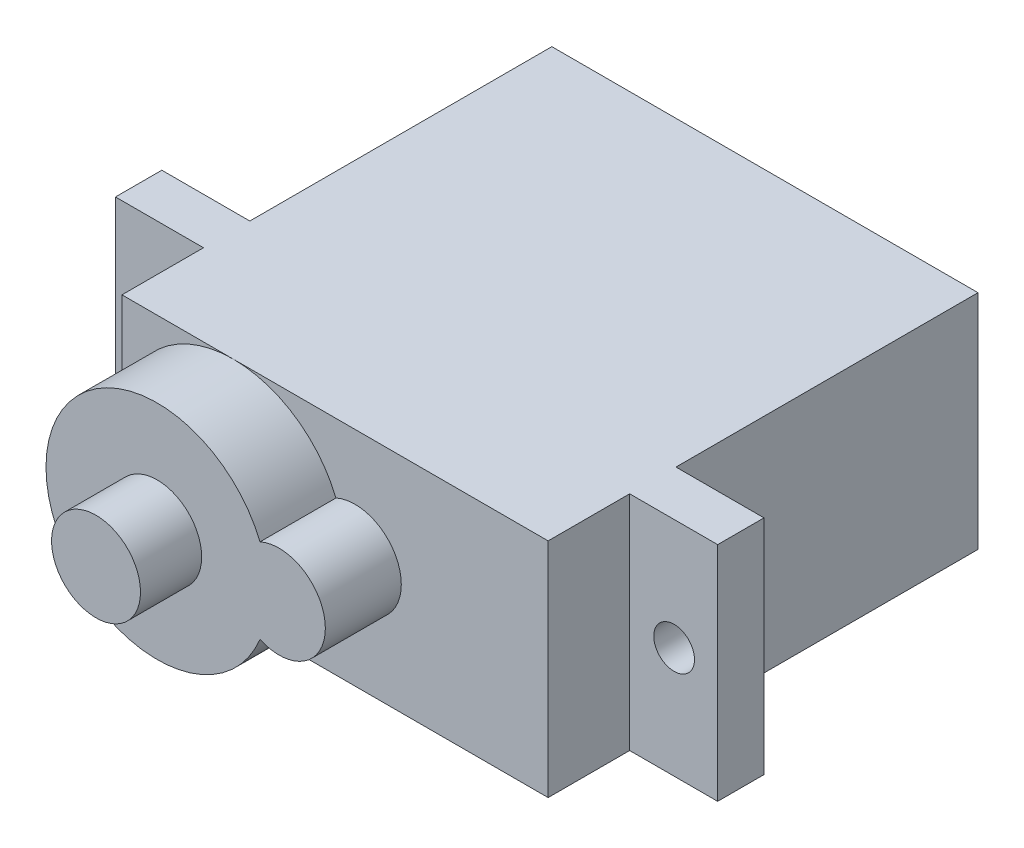
ISO-10303-21;
HEADER;
FILE_DESCRIPTION(('STEP AP214'),'2;1');
FILE_NAME('part.step','',(''),(''),'','','');
FILE_SCHEMA(('AUTOMOTIVE_DESIGN { 1 0 10303 214 1 1 1 1 }'));
ENDSEC;
DATA;
#1=APPLICATION_CONTEXT('core data for automotive mechanical design processes');
#2=APPLICATION_PROTOCOL_DEFINITION('international standard','automotive_design',2000,#1);
#3=PRODUCT_CONTEXT('',#1,'mechanical');
#4=PRODUCT('Part','Part','',(#3));
#5=PRODUCT_RELATED_PRODUCT_CATEGORY('part','',(#4));
#6=PRODUCT_DEFINITION_FORMATION('','',#4);
#7=PRODUCT_DEFINITION_CONTEXT('part definition',#1,'design');
#8=PRODUCT_DEFINITION('design','',#6,#7);
#9=PRODUCT_DEFINITION_SHAPE('','',#8);
#10=(LENGTH_UNIT() NAMED_UNIT(*) SI_UNIT(.MILLI.,.METRE.));
#11=(NAMED_UNIT(*) PLANE_ANGLE_UNIT() SI_UNIT($,.RADIAN.));
#12=(NAMED_UNIT(*) SI_UNIT($,.STERADIAN.) SOLID_ANGLE_UNIT());
#13=UNCERTAINTY_MEASURE_WITH_UNIT(LENGTH_MEASURE(1.E-05),#10,'distance_accuracy_value','');
#14=(GEOMETRIC_REPRESENTATION_CONTEXT(3) GLOBAL_UNCERTAINTY_ASSIGNED_CONTEXT((#13)) GLOBAL_UNIT_ASSIGNED_CONTEXT((#10,
#11,#12)) REPRESENTATION_CONTEXT('',''));
#15=CARTESIAN_POINT('',(0.,0.,0.));
#16=DIRECTION('',(0.,0.,1.));
#17=DIRECTION('',(1.,0.,0.));
#18=AXIS2_PLACEMENT_3D('',#15,#16,#17);
#19=CARTESIAN_POINT('',(-2.21209781529295,0.,27.3));
#20=DIRECTION('',(0.,0.,1.));
#21=DIRECTION('',(1.,0.,0.));
#22=AXIS2_PLACEMENT_3D('',#19,#20,#21);
#23=PLANE('',#22);
#24=CARTESIAN_POINT('',(1.0758043694141,0.,27.3));
#25=DIRECTION('',(0.,0.,1.));
#26=DIRECTION('',(1.,0.,0.));
#27=AXIS2_PLACEMENT_3D('',#24,#25,#26);
#28=CIRCLE('',#27,2.5);
#29=CARTESIAN_POINT('',(0.0499828617399273,-2.2798443443343,27.3));
#30=VERTEX_POINT('',#29);
#31=CARTESIAN_POINT('',(0.049982861739929,2.2798443443343,27.3));
#32=VERTEX_POINT('',#31);
#33=EDGE_CURVE('E155',#30,#32,#28,.T.);
#34=ORIENTED_EDGE('',*,*,#33,.T.);
#35=CARTESIAN_POINT('',(-5.5,0.,27.3));
#36=DIRECTION('',(0.,0.,1.));
#37=DIRECTION('',(1.,0.,0.));
#38=AXIS2_PLACEMENT_3D('',#35,#36,#37);
#39=CIRCLE('',#38,6.);
#40=EDGE_CURVE('E145',#32,#30,#39,.T.);
#41=ORIENTED_EDGE('',*,*,#40,.T.);
#42=EDGE_LOOP('',(#34,#41));
#43=FACE_BOUND('',#42,.T.);
#44=CARTESIAN_POINT('',(-5.5,0.,27.3));
#45=DIRECTION('',(0.,0.,1.));
#46=DIRECTION('',(1.,0.,0.));
#47=AXIS2_PLACEMENT_3D('',#44,#45,#46);
#48=CIRCLE('',#47,2.4);
#49=CARTESIAN_POINT('',(-3.1,0.,27.3));
#50=VERTEX_POINT('',#49);
#51=EDGE_CURVE('E365',#50,#50,#48,.T.);
#52=ORIENTED_EDGE('',*,*,#51,.F.);
#53=EDGE_LOOP('',(#52));
#54=FACE_BOUND('',#53,.T.);
#55=ADVANCED_FACE('F34',(#43,#54),#23,.T.);
#56=CARTESIAN_POINT('',(0.,0.,23.2));
#57=DIRECTION('',(0.,0.,1.));
#58=DIRECTION('',(1.,0.,0.));
#59=AXIS2_PLACEMENT_3D('',#56,#57,#58);
#60=PLANE('',#59);
#61=CARTESIAN_POINT('',(1.0758043694141,0.,23.2));
#62=DIRECTION('',(0.,0.,1.));
#63=DIRECTION('',(1.,0.,0.));
#64=AXIS2_PLACEMENT_3D('',#61,#62,#63);
#65=CIRCLE('',#64,2.5);
#66=CARTESIAN_POINT('',(0.0499828617399273,-2.2798443443343,23.2));
#67=VERTEX_POINT('',#66);
#68=CARTESIAN_POINT('',(0.049982861739929,2.2798443443343,23.2));
#69=VERTEX_POINT('',#68);
#70=EDGE_CURVE('E161',#67,#69,#65,.T.);
#71=ORIENTED_EDGE('',*,*,#70,.F.);
#72=CARTESIAN_POINT('',(-5.5,0.,23.2));
#73=DIRECTION('',(0.,0.,1.));
#74=DIRECTION('',(1.,0.,0.));
#75=AXIS2_PLACEMENT_3D('',#72,#73,#74);
#76=CIRCLE('',#75,6.);
#77=CARTESIAN_POINT('',(-5.5,-6.,23.2));
#78=VERTEX_POINT('',#77);
#79=EDGE_CURVE('E57',#78,#67,#76,.T.);
#80=ORIENTED_EDGE('',*,*,#79,.F.);
#81=DIRECTION('',(1.,0.,0.));
#82=VECTOR('',#81,1.);
#83=CARTESIAN_POINT('',(-11.5,-6.,23.2));
#84=LINE('',#83,#82);
#85=CARTESIAN_POINT('',(11.5,-6.,23.2));
#86=VERTEX_POINT('',#85);
#87=EDGE_CURVE('E179',#78,#86,#84,.T.);
#88=ORIENTED_EDGE('',*,*,#87,.T.);
#89=DIRECTION('',(0.,1.,0.));
#90=VECTOR('',#89,1.);
#91=CARTESIAN_POINT('',(11.5,6.,23.2));
#92=LINE('',#91,#90);
#93=CARTESIAN_POINT('',(11.5,6.,23.2));
#94=VERTEX_POINT('',#93);
#95=EDGE_CURVE('E169',#86,#94,#92,.T.);
#96=ORIENTED_EDGE('',*,*,#95,.T.);
#97=DIRECTION('',(-1.,0.,0.));
#98=VECTOR('',#97,1.);
#99=CARTESIAN_POINT('',(-11.5,6.,23.2));
#100=LINE('',#99,#98);
#101=CARTESIAN_POINT('',(-5.5,6.,23.2));
#102=VERTEX_POINT('',#101);
#103=EDGE_CURVE('E173',#94,#102,#100,.T.);
#104=ORIENTED_EDGE('',*,*,#103,.T.);
#105=EDGE_CURVE('E45',#69,#102,#76,.T.);
#106=ORIENTED_EDGE('',*,*,#105,.F.);
#107=EDGE_LOOP('',(#71,#80,#88,#96,#104,#106));
#108=FACE_BOUND('',#107,.T.);
#109=ADVANCED_FACE('F379',(#108),#60,.T.);
#110=CARTESIAN_POINT('',(-11.5,0.,23.2));
#111=VERTEX_POINT('',#110);
#112=EDGE_CURVE('E11',#102,#111,#76,.T.);
#113=ORIENTED_EDGE('',*,*,#112,.F.);
#114=CARTESIAN_POINT('',(-11.5,6.,23.2));
#115=VERTEX_POINT('',#114);
#116=EDGE_CURVE('E172',#102,#115,#100,.T.);
#117=ORIENTED_EDGE('',*,*,#116,.T.);
#118=DIRECTION('',(0.,-1.,0.));
#119=VECTOR('',#118,1.);
#120=CARTESIAN_POINT('',(-11.5,6.,23.2));
#121=LINE('',#120,#119);
#122=EDGE_CURVE('E176',#115,#111,#121,.T.);
#123=ORIENTED_EDGE('',*,*,#122,.T.);
#124=EDGE_LOOP('',(#113,#117,#123));
#125=FACE_BOUND('',#124,.T.);
#126=ADVANCED_FACE('F360',(#125),#60,.T.);
#127=CARTESIAN_POINT('',(0.,0.,18.8));
#128=DIRECTION('',(0.,0.,1.));
#129=DIRECTION('',(1.,0.,0.));
#130=AXIS2_PLACEMENT_3D('',#127,#128,#129);
#131=PLANE('',#130);
#132=DIRECTION('',(0.,1.,0.));
#133=VECTOR('',#132,1.);
#134=CARTESIAN_POINT('',(11.5,6.,18.8));
#135=LINE('',#134,#133);
#136=CARTESIAN_POINT('',(11.5,-6.,18.8));
#137=VERTEX_POINT('',#136);
#138=CARTESIAN_POINT('',(11.5,6.,18.8));
#139=VERTEX_POINT('',#138);
#140=EDGE_CURVE('E162',#137,#139,#135,.T.);
#141=ORIENTED_EDGE('',*,*,#140,.F.);
#142=DIRECTION('',(1.,0.,0.));
#143=VECTOR('',#142,1.);
#144=CARTESIAN_POINT('',(-16.25,-6.,18.8));
#145=LINE('',#144,#143);
#146=CARTESIAN_POINT('',(16.25,-6.,18.8));
#147=VERTEX_POINT('',#146);
#148=EDGE_CURVE('E342',#137,#147,#145,.T.);
#149=ORIENTED_EDGE('',*,*,#148,.T.);
#150=DIRECTION('',(0.,1.,0.));
#151=VECTOR('',#150,1.);
#152=CARTESIAN_POINT('',(16.25,6.,18.8));
#153=LINE('',#152,#151);
#154=CARTESIAN_POINT('',(16.25,6.,18.8));
#155=VERTEX_POINT('',#154);
#156=EDGE_CURVE('E230',#147,#155,#153,.T.);
#157=ORIENTED_EDGE('',*,*,#156,.T.);
#158=DIRECTION('',(-1.,0.,0.));
#159=VECTOR('',#158,1.);
#160=CARTESIAN_POINT('',(-16.25,6.,18.8));
#161=LINE('',#160,#159);
#162=EDGE_CURVE('E243',#155,#139,#161,.T.);
#163=ORIENTED_EDGE('',*,*,#162,.T.);
#164=EDGE_LOOP('',(#141,#149,#157,#163));
#165=FACE_BOUND('',#164,.T.);
#166=CARTESIAN_POINT('',(13.9,0.,18.8));
#167=DIRECTION('',(0.,0.,1.));
#168=DIRECTION('',(1.,0.,0.));
#169=AXIS2_PLACEMENT_3D('',#166,#167,#168);
#170=CIRCLE('',#169,1.1);
#171=CARTESIAN_POINT('',(15.,0.,18.8));
#172=VERTEX_POINT('',#171);
#173=EDGE_CURVE('E217',#172,#172,#170,.T.);
#174=ORIENTED_EDGE('',*,*,#173,.F.);
#175=EDGE_LOOP('',(#174));
#176=FACE_BOUND('',#175,.T.);
#177=ADVANCED_FACE('F410',(#165,#176),#131,.T.);
#178=CARTESIAN_POINT('',(11.5,6.,16.3));
#179=DIRECTION('',(-1.,0.,0.));
#180=DIRECTION('',(0.,-1.,0.));
#181=AXIS2_PLACEMENT_3D('',#178,#179,#180);
#182=PLANE('',#181);
#183=DIRECTION('',(0.,1.,0.));
#184=VECTOR('',#183,1.);
#185=CARTESIAN_POINT('',(11.5,6.,0.));
#186=LINE('',#185,#184);
#187=CARTESIAN_POINT('',(11.5,-6.,0.));
#188=VERTEX_POINT('',#187);
#189=CARTESIAN_POINT('',(11.5,6.,0.));
#190=VERTEX_POINT('',#189);
#191=EDGE_CURVE('E273',#188,#190,#186,.T.);
#192=ORIENTED_EDGE('',*,*,#191,.T.);
#193=DIRECTION('',(0.,0.,-1.));
#194=VECTOR('',#193,1.);
#195=CARTESIAN_POINT('',(11.5,6.,16.3));
#196=LINE('',#195,#194);
#197=CARTESIAN_POINT('',(11.5,6.,16.3));
#198=VERTEX_POINT('',#197);
#199=EDGE_CURVE('E254',#198,#190,#196,.T.);
#200=ORIENTED_EDGE('',*,*,#199,.F.);
#201=DIRECTION('',(0.,1.,0.));
#202=VECTOR('',#201,1.);
#203=CARTESIAN_POINT('',(11.5,6.,16.3));
#204=LINE('',#203,#202);
#205=CARTESIAN_POINT('',(11.5,-6.,16.3));
#206=VERTEX_POINT('',#205);
#207=EDGE_CURVE('E258',#206,#198,#204,.T.);
#208=ORIENTED_EDGE('',*,*,#207,.F.);
#209=DIRECTION('',(0.,0.,-1.));
#210=VECTOR('',#209,1.);
#211=CARTESIAN_POINT('',(11.5,-6.,16.3));
#212=LINE('',#211,#210);
#213=EDGE_CURVE('E247',#206,#188,#212,.T.);
#214=ORIENTED_EDGE('',*,*,#213,.T.);
#215=EDGE_LOOP('',(#192,#200,#208,#214));
#216=FACE_BOUND('',#215,.T.);
#217=ADVANCED_FACE('F36',(#216),#182,.F.);
#218=CARTESIAN_POINT('',(-11.5,6.,16.3));
#219=DIRECTION('',(0.,-1.,0.));
#220=DIRECTION('',(0.,0.,-1.));
#221=AXIS2_PLACEMENT_3D('',#218,#219,#220);
#222=PLANE('',#221);
#223=DIRECTION('',(-1.,0.,0.));
#224=VECTOR('',#223,1.);
#225=CARTESIAN_POINT('',(-11.5,6.,0.));
#226=LINE('',#225,#224);
#227=CARTESIAN_POINT('',(-11.5,6.,0.));
#228=VERTEX_POINT('',#227);
#229=EDGE_CURVE('E290',#190,#228,#226,.T.);
#230=ORIENTED_EDGE('',*,*,#229,.T.);
#231=DIRECTION('',(0.,0.,-1.));
#232=VECTOR('',#231,1.);
#233=CARTESIAN_POINT('',(-11.5,6.,16.3));
#234=LINE('',#233,#232);
#235=CARTESIAN_POINT('',(-11.5,6.,16.3));
#236=VERTEX_POINT('',#235);
#237=EDGE_CURVE('E257',#236,#228,#234,.T.);
#238=ORIENTED_EDGE('',*,*,#237,.F.);
#239=DIRECTION('',(-1.,0.,0.));
#240=VECTOR('',#239,1.);
#241=CARTESIAN_POINT('',(-16.25,6.,16.3));
#242=LINE('',#241,#240);
#243=CARTESIAN_POINT('',(-16.25,6.,16.3));
#244=VERTEX_POINT('',#243);
#245=EDGE_CURVE('E268',#236,#244,#242,.T.);
#246=ORIENTED_EDGE('',*,*,#245,.T.);
#247=DIRECTION('',(0.,0.,-1.));
#248=VECTOR('',#247,1.);
#249=CARTESIAN_POINT('',(-16.25,6.,18.8));
#250=LINE('',#249,#248);
#251=CARTESIAN_POINT('',(-16.25,6.,18.8));
#252=VERTEX_POINT('',#251);
#253=EDGE_CURVE('E296',#252,#244,#250,.T.);
#254=ORIENTED_EDGE('',*,*,#253,.F.);
#255=CARTESIAN_POINT('',(-11.5,6.,18.8));
#256=VERTEX_POINT('',#255);
#257=EDGE_CURVE('E233',#256,#252,#161,.T.);
#258=ORIENTED_EDGE('',*,*,#257,.F.);
#259=DIRECTION('',(0.,0.,-1.));
#260=VECTOR('',#259,1.);
#261=CARTESIAN_POINT('',(-11.5,6.,23.2));
#262=LINE('',#261,#260);
#263=EDGE_CURVE('E197',#115,#256,#262,.T.);
#264=ORIENTED_EDGE('',*,*,#263,.F.);
#265=ORIENTED_EDGE('',*,*,#116,.F.);
#266=ORIENTED_EDGE('',*,*,#103,.F.);
#267=DIRECTION('',(0.,0.,-1.));
#268=VECTOR('',#267,1.);
#269=CARTESIAN_POINT('',(11.5,6.,23.2));
#270=LINE('',#269,#268);
#271=EDGE_CURVE('E204',#94,#139,#270,.T.);
#272=ORIENTED_EDGE('',*,*,#271,.T.);
#273=ORIENTED_EDGE('',*,*,#162,.F.);
#274=DIRECTION('',(0.,0.,-1.));
#275=VECTOR('',#274,1.);
#276=CARTESIAN_POINT('',(16.25,6.,18.8));
#277=LINE('',#276,#275);
#278=CARTESIAN_POINT('',(16.25,6.,16.3));
#279=VERTEX_POINT('',#278);
#280=EDGE_CURVE('E292',#155,#279,#277,.T.);
#281=ORIENTED_EDGE('',*,*,#280,.T.);
#282=EDGE_CURVE('E336',#279,#198,#242,.T.);
#283=ORIENTED_EDGE('',*,*,#282,.T.);
#284=ORIENTED_EDGE('',*,*,#199,.T.);
#285=EDGE_LOOP('',(#230,#238,#246,#254,#258,#264,#265,#266,#272,#273,#281,#283,#284));
#286=FACE_BOUND('',#285,.T.);
#287=ADVANCED_FACE('F352',(#286),#222,.F.);
#288=CARTESIAN_POINT('',(-11.5,6.,16.3));
#289=DIRECTION('',(1.,0.,0.));
#290=DIRECTION('',(0.,1.,0.));
#291=AXIS2_PLACEMENT_3D('',#288,#289,#290);
#292=PLANE('',#291);
#293=DIRECTION('',(0.,-1.,0.));
#294=VECTOR('',#293,1.);
#295=CARTESIAN_POINT('',(-11.5,6.,0.));
#296=LINE('',#295,#294);
#297=CARTESIAN_POINT('',(-11.5,-6.,0.));
#298=VERTEX_POINT('',#297);
#299=EDGE_CURVE('E289',#228,#298,#296,.T.);
#300=ORIENTED_EDGE('',*,*,#299,.T.);
#301=DIRECTION('',(0.,0.,-1.));
#302=VECTOR('',#301,1.);
#303=CARTESIAN_POINT('',(-11.5,-6.,16.3));
#304=LINE('',#303,#302);
#305=CARTESIAN_POINT('',(-11.5,-6.,16.3));
#306=VERTEX_POINT('',#305);
#307=EDGE_CURVE('E250',#306,#298,#304,.T.);
#308=ORIENTED_EDGE('',*,*,#307,.F.);
#309=DIRECTION('',(0.,-1.,0.));
#310=VECTOR('',#309,1.);
#311=CARTESIAN_POINT('',(-11.5,6.,16.3));
#312=LINE('',#311,#310);
#313=EDGE_CURVE('E251',#236,#306,#312,.T.);
#314=ORIENTED_EDGE('',*,*,#313,.F.);
#315=ORIENTED_EDGE('',*,*,#237,.T.);
#316=EDGE_LOOP('',(#300,#308,#314,#315));
#317=FACE_BOUND('',#316,.T.);
#318=ADVANCED_FACE('F327',(#317),#292,.F.);
#319=CARTESIAN_POINT('',(-11.5,-6.,16.3));
#320=DIRECTION('',(0.,1.,0.));
#321=DIRECTION('',(0.,0.,1.));
#322=AXIS2_PLACEMENT_3D('',#319,#320,#321);
#323=PLANE('',#322);
#324=DIRECTION('',(1.,0.,0.));
#325=VECTOR('',#324,1.);
#326=CARTESIAN_POINT('',(-11.5,-6.,0.));
#327=LINE('',#326,#325);
#328=EDGE_CURVE('E262',#298,#188,#327,.T.);
#329=ORIENTED_EDGE('',*,*,#328,.T.);
#330=ORIENTED_EDGE('',*,*,#213,.F.);
#331=DIRECTION('',(1.,0.,0.));
#332=VECTOR('',#331,1.);
#333=CARTESIAN_POINT('',(-16.25,-6.,16.3));
#334=LINE('',#333,#332);
#335=CARTESIAN_POINT('',(16.25,-6.,16.3));
#336=VERTEX_POINT('',#335);
#337=EDGE_CURVE('E308',#206,#336,#334,.T.);
#338=ORIENTED_EDGE('',*,*,#337,.T.);
#339=DIRECTION('',(0.,0.,-1.));
#340=VECTOR('',#339,1.);
#341=CARTESIAN_POINT('',(16.25,-6.,18.8));
#342=LINE('',#341,#340);
#343=EDGE_CURVE('E313',#147,#336,#342,.T.);
#344=ORIENTED_EDGE('',*,*,#343,.F.);
#345=ORIENTED_EDGE('',*,*,#148,.F.);
#346=DIRECTION('',(0.,0.,-1.));
#347=VECTOR('',#346,1.);
#348=CARTESIAN_POINT('',(11.5,-6.,23.2));
#349=LINE('',#348,#347);
#350=EDGE_CURVE('E183',#86,#137,#349,.T.);
#351=ORIENTED_EDGE('',*,*,#350,.F.);
#352=ORIENTED_EDGE('',*,*,#87,.F.);
#353=CARTESIAN_POINT('',(-11.5,-6.,23.2));
#354=VERTEX_POINT('',#353);
#355=EDGE_CURVE('E180',#354,#78,#84,.T.);
#356=ORIENTED_EDGE('',*,*,#355,.F.);
#357=DIRECTION('',(0.,0.,-1.));
#358=VECTOR('',#357,1.);
#359=CARTESIAN_POINT('',(-11.5,-6.,23.2));
#360=LINE('',#359,#358);
#361=CARTESIAN_POINT('',(-11.5,-6.,18.8));
#362=VERTEX_POINT('',#361);
#363=EDGE_CURVE('E192',#354,#362,#360,.T.);
#364=ORIENTED_EDGE('',*,*,#363,.T.);
#365=CARTESIAN_POINT('',(-16.25,-6.,18.8));
#366=VERTEX_POINT('',#365);
#367=EDGE_CURVE('E316',#366,#362,#145,.T.);
#368=ORIENTED_EDGE('',*,*,#367,.F.);
#369=DIRECTION('',(0.,0.,-1.));
#370=VECTOR('',#369,1.);
#371=CARTESIAN_POINT('',(-16.25,-6.,18.8));
#372=LINE('',#371,#370);
#373=CARTESIAN_POINT('',(-16.25,-6.,16.3));
#374=VERTEX_POINT('',#373);
#375=EDGE_CURVE('E302',#366,#374,#372,.T.);
#376=ORIENTED_EDGE('',*,*,#375,.T.);
#377=EDGE_CURVE('E234',#374,#306,#334,.T.);
#378=ORIENTED_EDGE('',*,*,#377,.T.);
#379=ORIENTED_EDGE('',*,*,#307,.T.);
#380=EDGE_LOOP('',(#329,#330,#338,#344,#345,#351,#352,#356,#364,#368,#376,#378,#379));
#381=FACE_BOUND('',#380,.T.);
#382=ADVANCED_FACE('F320',(#381),#323,.F.);
#383=CARTESIAN_POINT('',(0.,0.,0.));
#384=DIRECTION('',(0.,0.,1.));
#385=DIRECTION('',(1.,0.,0.));
#386=AXIS2_PLACEMENT_3D('',#383,#384,#385);
#387=PLANE('',#386);
#388=ORIENTED_EDGE('',*,*,#191,.F.);
#389=ORIENTED_EDGE('',*,*,#328,.F.);
#390=ORIENTED_EDGE('',*,*,#299,.F.);
#391=ORIENTED_EDGE('',*,*,#229,.F.);
#392=EDGE_LOOP('',(#388,#389,#390,#391));
#393=FACE_BOUND('',#392,.T.);
#394=ADVANCED_FACE('F329',(#393),#387,.F.);
#395=CARTESIAN_POINT('',(0.,0.,16.3));
#396=DIRECTION('',(0.,0.,1.));
#397=DIRECTION('',(1.,0.,0.));
#398=AXIS2_PLACEMENT_3D('',#395,#396,#397);
#399=PLANE('',#398);
#400=CARTESIAN_POINT('',(13.9,0.,16.3));
#401=DIRECTION('',(0.,0.,1.));
#402=DIRECTION('',(1.,0.,0.));
#403=AXIS2_PLACEMENT_3D('',#400,#401,#402);
#404=CIRCLE('',#403,1.1);
#405=CARTESIAN_POINT('',(15.,0.,16.3));
#406=VERTEX_POINT('',#405);
#407=EDGE_CURVE('E213',#406,#406,#404,.T.);
#408=ORIENTED_EDGE('',*,*,#407,.T.);
#409=EDGE_LOOP('',(#408));
#410=FACE_BOUND('',#409,.T.);
#411=ORIENTED_EDGE('',*,*,#337,.F.);
#412=ORIENTED_EDGE('',*,*,#207,.T.);
#413=ORIENTED_EDGE('',*,*,#282,.F.);
#414=DIRECTION('',(0.,1.,0.));
#415=VECTOR('',#414,1.);
#416=CARTESIAN_POINT('',(16.25,6.,16.3));
#417=LINE('',#416,#415);
#418=EDGE_CURVE('E227',#336,#279,#417,.T.);
#419=ORIENTED_EDGE('',*,*,#418,.F.);
#420=EDGE_LOOP('',(#411,#412,#413,#419));
#421=FACE_BOUND('',#420,.T.);
#422=ADVANCED_FACE('F334',(#410,#421),#399,.F.);
#423=CARTESIAN_POINT('',(-13.9,0.,16.3));
#424=DIRECTION('',(0.,0.,1.));
#425=DIRECTION('',(1.,0.,0.));
#426=AXIS2_PLACEMENT_3D('',#423,#424,#425);
#427=CIRCLE('',#426,1.1);
#428=CARTESIAN_POINT('',(-12.8,0.,16.3));
#429=VERTEX_POINT('',#428);
#430=EDGE_CURVE('E222',#429,#429,#427,.T.);
#431=ORIENTED_EDGE('',*,*,#430,.T.);
#432=EDGE_LOOP('',(#431));
#433=FACE_BOUND('',#432,.T.);
#434=ORIENTED_EDGE('',*,*,#245,.F.);
#435=ORIENTED_EDGE('',*,*,#313,.T.);
#436=ORIENTED_EDGE('',*,*,#377,.F.);
#437=DIRECTION('',(0.,-1.,0.));
#438=VECTOR('',#437,1.);
#439=CARTESIAN_POINT('',(-16.25,6.,16.3));
#440=LINE('',#439,#438);
#441=EDGE_CURVE('E312',#244,#374,#440,.T.);
#442=ORIENTED_EDGE('',*,*,#441,.F.);
#443=EDGE_LOOP('',(#434,#435,#436,#442));
#444=FACE_BOUND('',#443,.T.);
#445=ADVANCED_FACE('F326',(#433,#444),#399,.F.);
#446=DIRECTION('',(0.,-1.,0.));
#447=VECTOR('',#446,1.);
#448=CARTESIAN_POINT('',(-11.5,6.,18.8));
#449=LINE('',#448,#447);
#450=EDGE_CURVE('E165',#256,#362,#449,.T.);
#451=ORIENTED_EDGE('',*,*,#450,.F.);
#452=ORIENTED_EDGE('',*,*,#257,.T.);
#453=DIRECTION('',(0.,-1.,0.));
#454=VECTOR('',#453,1.);
#455=CARTESIAN_POINT('',(-16.25,6.,18.8));
#456=LINE('',#455,#454);
#457=EDGE_CURVE('E237',#252,#366,#456,.T.);
#458=ORIENTED_EDGE('',*,*,#457,.T.);
#459=ORIENTED_EDGE('',*,*,#367,.T.);
#460=EDGE_LOOP('',(#451,#452,#458,#459));
#461=FACE_BOUND('',#460,.T.);
#462=CARTESIAN_POINT('',(-13.9,0.,18.8));
#463=DIRECTION('',(0.,0.,1.));
#464=DIRECTION('',(1.,0.,0.));
#465=AXIS2_PLACEMENT_3D('',#462,#463,#464);
#466=CIRCLE('',#465,1.1);
#467=CARTESIAN_POINT('',(-12.8,0.,18.8));
#468=VERTEX_POINT('',#467);
#469=EDGE_CURVE('E224',#468,#468,#466,.T.);
#470=ORIENTED_EDGE('',*,*,#469,.F.);
#471=EDGE_LOOP('',(#470));
#472=FACE_BOUND('',#471,.T.);
#473=ADVANCED_FACE('F347',(#461,#472),#131,.T.);
#474=CARTESIAN_POINT('',(16.25,6.,18.8));
#475=DIRECTION('',(-1.,0.,0.));
#476=DIRECTION('',(0.,0.,1.));
#477=AXIS2_PLACEMENT_3D('',#474,#475,#476);
#478=PLANE('',#477);
#479=ORIENTED_EDGE('',*,*,#418,.T.);
#480=ORIENTED_EDGE('',*,*,#280,.F.);
#481=ORIENTED_EDGE('',*,*,#156,.F.);
#482=ORIENTED_EDGE('',*,*,#343,.T.);
#483=EDGE_LOOP('',(#479,#480,#481,#482));
#484=FACE_BOUND('',#483,.T.);
#485=ADVANCED_FACE('F409',(#484),#478,.F.);
#486=CARTESIAN_POINT('',(-16.25,6.,18.8));
#487=DIRECTION('',(1.,0.,0.));
#488=DIRECTION('',(0.,0.,-1.));
#489=AXIS2_PLACEMENT_3D('',#486,#487,#488);
#490=PLANE('',#489);
#491=ORIENTED_EDGE('',*,*,#441,.T.);
#492=ORIENTED_EDGE('',*,*,#375,.F.);
#493=ORIENTED_EDGE('',*,*,#457,.F.);
#494=ORIENTED_EDGE('',*,*,#253,.T.);
#495=EDGE_LOOP('',(#491,#492,#493,#494));
#496=FACE_BOUND('',#495,.T.);
#497=ADVANCED_FACE('F351',(#496),#490,.F.);
#498=CARTESIAN_POINT('',(-13.9,0.,18.8));
#499=DIRECTION('',(0.,0.,-1.));
#500=DIRECTION('',(-1.,0.,0.));
#501=AXIS2_PLACEMENT_3D('',#498,#499,#500);
#502=CYLINDRICAL_SURFACE('',#501,1.1);
#503=ORIENTED_EDGE('',*,*,#469,.T.);
#504=EDGE_LOOP('',(#503));
#505=FACE_BOUND('',#504,.T.);
#506=ORIENTED_EDGE('',*,*,#430,.F.);
#507=EDGE_LOOP('',(#506));
#508=FACE_BOUND('',#507,.T.);
#509=ADVANCED_FACE('F402',(#505,#508),#502,.F.);
#510=CARTESIAN_POINT('',(13.9,0.,18.8));
#511=DIRECTION('',(0.,0.,-1.));
#512=DIRECTION('',(-1.,0.,0.));
#513=AXIS2_PLACEMENT_3D('',#510,#511,#512);
#514=CYLINDRICAL_SURFACE('',#513,1.1);
#515=ORIENTED_EDGE('',*,*,#173,.T.);
#516=EDGE_LOOP('',(#515));
#517=FACE_BOUND('',#516,.T.);
#518=ORIENTED_EDGE('',*,*,#407,.F.);
#519=EDGE_LOOP('',(#518));
#520=FACE_BOUND('',#519,.T.);
#521=ADVANCED_FACE('F399',(#517,#520),#514,.F.);
#522=CARTESIAN_POINT('',(11.5,6.,23.2));
#523=DIRECTION('',(-1.,0.,0.));
#524=DIRECTION('',(0.,0.,1.));
#525=AXIS2_PLACEMENT_3D('',#522,#523,#524);
#526=PLANE('',#525);
#527=ORIENTED_EDGE('',*,*,#140,.T.);
#528=ORIENTED_EDGE('',*,*,#271,.F.);
#529=ORIENTED_EDGE('',*,*,#95,.F.);
#530=ORIENTED_EDGE('',*,*,#350,.T.);
#531=EDGE_LOOP('',(#527,#528,#529,#530));
#532=FACE_BOUND('',#531,.T.);
#533=ADVANCED_FACE('F396',(#532),#526,.F.);
#534=CARTESIAN_POINT('',(-11.5,6.,23.2));
#535=DIRECTION('',(1.,0.,0.));
#536=DIRECTION('',(0.,0.,-1.));
#537=AXIS2_PLACEMENT_3D('',#534,#535,#536);
#538=PLANE('',#537);
#539=ORIENTED_EDGE('',*,*,#450,.T.);
#540=ORIENTED_EDGE('',*,*,#363,.F.);
#541=EDGE_CURVE('E175',#111,#354,#121,.T.);
#542=ORIENTED_EDGE('',*,*,#541,.F.);
#543=ORIENTED_EDGE('',*,*,#122,.F.);
#544=ORIENTED_EDGE('',*,*,#263,.T.);
#545=EDGE_LOOP('',(#539,#540,#542,#543,#544));
#546=FACE_BOUND('',#545,.T.);
#547=ADVANCED_FACE('F357',(#546),#538,.F.);
#548=EDGE_CURVE('E43',#111,#78,#76,.T.);
#549=ORIENTED_EDGE('',*,*,#548,.F.);
#550=ORIENTED_EDGE('',*,*,#541,.T.);
#551=ORIENTED_EDGE('',*,*,#355,.T.);
#552=EDGE_LOOP('',(#549,#550,#551));
#553=FACE_BOUND('',#552,.T.);
#554=ADVANCED_FACE('F385',(#553),#60,.T.);
#555=CARTESIAN_POINT('',(1.0758043694141,0.,27.3));
#556=DIRECTION('',(0.,0.,-1.));
#557=DIRECTION('',(-1.,0.,0.));
#558=AXIS2_PLACEMENT_3D('',#555,#556,#557);
#559=CYLINDRICAL_SURFACE('',#558,2.5);
#560=ORIENTED_EDGE('',*,*,#70,.T.);
#561=DIRECTION('',(0.,0.,-1.));
#562=VECTOR('',#561,1.);
#563=CARTESIAN_POINT('',(0.049982861739929,2.2798443443343,27.3));
#564=LINE('',#563,#562);
#565=EDGE_CURVE('E149',#32,#69,#564,.T.);
#566=ORIENTED_EDGE('',*,*,#565,.F.);
#567=ORIENTED_EDGE('',*,*,#33,.F.);
#568=DIRECTION('',(0.,0.,-1.));
#569=VECTOR('',#568,1.);
#570=CARTESIAN_POINT('',(0.0499828617399273,-2.2798443443343,27.3));
#571=LINE('',#570,#569);
#572=EDGE_CURVE('E152',#30,#67,#571,.T.);
#573=ORIENTED_EDGE('',*,*,#572,.T.);
#574=EDGE_LOOP('',(#560,#566,#567,#573));
#575=FACE_BOUND('',#574,.T.);
#576=ADVANCED_FACE('F160',(#575),#559,.T.);
#577=CARTESIAN_POINT('',(-5.5,0.,27.3));
#578=DIRECTION('',(0.,0.,-1.));
#579=DIRECTION('',(-1.,0.,0.));
#580=AXIS2_PLACEMENT_3D('',#577,#578,#579);
#581=CYLINDRICAL_SURFACE('',#580,6.);
#582=ORIENTED_EDGE('',*,*,#105,.T.);
#583=ORIENTED_EDGE('',*,*,#112,.T.);
#584=ORIENTED_EDGE('',*,*,#548,.T.);
#585=ORIENTED_EDGE('',*,*,#79,.T.);
#586=ORIENTED_EDGE('',*,*,#572,.F.);
#587=ORIENTED_EDGE('',*,*,#40,.F.);
#588=ORIENTED_EDGE('',*,*,#565,.T.);
#589=EDGE_LOOP('',(#582,#583,#584,#585,#586,#587,#588));
#590=FACE_BOUND('',#589,.T.);
#591=ADVANCED_FACE('F147',(#590),#581,.T.);
#592=CARTESIAN_POINT('',(-5.5,0.,30.6));
#593=DIRECTION('',(0.,0.,-1.));
#594=DIRECTION('',(-1.,0.,0.));
#595=AXIS2_PLACEMENT_3D('',#592,#593,#594);
#596=CYLINDRICAL_SURFACE('',#595,2.4);
#597=CARTESIAN_POINT('',(-5.5,0.,30.6));
#598=DIRECTION('',(0.,0.,1.));
#599=DIRECTION('',(1.,0.,0.));
#600=AXIS2_PLACEMENT_3D('',#597,#598,#599);
#601=CIRCLE('',#600,2.4);
#602=CARTESIAN_POINT('',(-3.1,0.,30.6));
#603=VERTEX_POINT('',#602);
#604=EDGE_CURVE('E362',#603,#603,#601,.T.);
#605=ORIENTED_EDGE('',*,*,#604,.F.);
#606=EDGE_LOOP('',(#605));
#607=FACE_BOUND('',#606,.T.);
#608=ORIENTED_EDGE('',*,*,#51,.T.);
#609=EDGE_LOOP('',(#608));
#610=FACE_BOUND('',#609,.T.);
#611=ADVANCED_FACE('F373',(#607,#610),#596,.T.);
#612=CARTESIAN_POINT('',(-5.5,0.,30.6));
#613=DIRECTION('',(0.,0.,1.));
#614=DIRECTION('',(1.,0.,0.));
#615=AXIS2_PLACEMENT_3D('',#612,#613,#614);
#616=PLANE('',#615);
#617=ORIENTED_EDGE('',*,*,#604,.T.);
#618=EDGE_LOOP('',(#617));
#619=FACE_BOUND('',#618,.T.);
#620=ADVANCED_FACE('F371',(#619),#616,.T.);
#621=CLOSED_SHELL('',(#55,#109,#126,#177,#217,#287,#318,#382,#394,#422,#445,#473,#485,#497,#509,
#521,#533,#547,#554,#576,#591,#611,#620));
#622=MANIFOLD_SOLID_BREP('B2',#621);
#623=ADVANCED_BREP_SHAPE_REPRESENTATION('',(#18,#622),#14);
#624=SHAPE_DEFINITION_REPRESENTATION(#9,#623);
ENDSEC;
END-ISO-10303-21;
